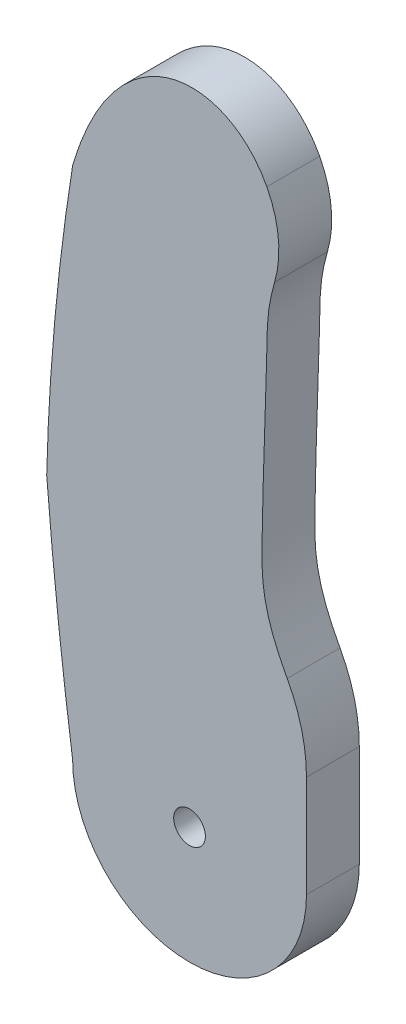
ISO-10303-21;
HEADER;
FILE_DESCRIPTION(('STEP AP214'),'2;1');
FILE_NAME('part.step','',(''),(''),'','','');
FILE_SCHEMA(('AUTOMOTIVE_DESIGN { 1 0 10303 214 1 1 1 1 }'));
ENDSEC;
DATA;
#1=APPLICATION_CONTEXT('core data for automotive mechanical design processes');
#2=APPLICATION_PROTOCOL_DEFINITION('international standard','automotive_design',2000,#1);
#3=PRODUCT_CONTEXT('',#1,'mechanical');
#4=PRODUCT('Part','Part','',(#3));
#5=PRODUCT_RELATED_PRODUCT_CATEGORY('part','',(#4));
#6=PRODUCT_DEFINITION_FORMATION('','',#4);
#7=PRODUCT_DEFINITION_CONTEXT('part definition',#1,'design');
#8=PRODUCT_DEFINITION('design','',#6,#7);
#9=PRODUCT_DEFINITION_SHAPE('','',#8);
#10=(LENGTH_UNIT() NAMED_UNIT(*) SI_UNIT(.MILLI.,.METRE.));
#11=(NAMED_UNIT(*) PLANE_ANGLE_UNIT() SI_UNIT($,.RADIAN.));
#12=(NAMED_UNIT(*) SI_UNIT($,.STERADIAN.) SOLID_ANGLE_UNIT());
#13=UNCERTAINTY_MEASURE_WITH_UNIT(LENGTH_MEASURE(1.E-05),#10,'distance_accuracy_value','');
#14=(GEOMETRIC_REPRESENTATION_CONTEXT(3) GLOBAL_UNCERTAINTY_ASSIGNED_CONTEXT((#13)) GLOBAL_UNIT_ASSIGNED_CONTEXT((#10,
#11,#12)) REPRESENTATION_CONTEXT('',''));
#15=CARTESIAN_POINT('',(0.,0.,0.));
#16=DIRECTION('',(0.,0.,1.));
#17=DIRECTION('',(1.,0.,0.));
#18=AXIS2_PLACEMENT_3D('',#15,#16,#17);
#19=CARTESIAN_POINT('',(-46.6058619597334,0.,5.));
#20=CARTESIAN_POINT('',(-45.7112575391299,-11.0890557128128,5.));
#21=CARTESIAN_POINT('',(-44.1531992134322,-22.0996926023876,5.));
#22=B_SPLINE_CURVE_WITH_KNOTS('',2,(#19,#20,#21),.UNSPECIFIED.,.F.,.F.,(3,3),(0.,1.),.UNSPECIFIED.);
#23=DIRECTION('',(0.,0.,-1.));
#24=VECTOR('',#23,1.);
#25=SURFACE_OF_LINEAR_EXTRUSION('',#22,#24);
#26=CARTESIAN_POINT('',(-46.6058619597334,0.,0.));
#27=CARTESIAN_POINT('',(-45.7112575391299,-11.0890557128128,0.));
#28=CARTESIAN_POINT('',(-44.1531992134322,-22.0996926023876,0.));
#29=B_SPLINE_CURVE_WITH_KNOTS('',2,(#26,#27,#28),.UNSPECIFIED.,.F.,.F.,(3,3),(0.,1.),.UNSPECIFIED.);
#30=CARTESIAN_POINT('',(-46.6058619597334,0.,0.));
#31=VERTEX_POINT('',#30);
#32=CARTESIAN_POINT('',(-44.1531992134322,-22.0996926023876,0.));
#33=VERTEX_POINT('',#32);
#34=EDGE_CURVE('E178',#31,#33,#29,.T.);
#35=ORIENTED_EDGE('',*,*,#34,.T.);
#36=DIRECTION('',(0.,0.,-1.));
#37=VECTOR('',#36,1.);
#38=CARTESIAN_POINT('',(-44.1531992134322,-22.0996926023876,5.));
#39=LINE('',#38,#37);
#40=CARTESIAN_POINT('',(-44.1531992134322,-22.0996926023876,5.));
#41=VERTEX_POINT('',#40);
#42=EDGE_CURVE('E11',#41,#33,#39,.T.);
#43=ORIENTED_EDGE('',*,*,#42,.F.);
#44=CARTESIAN_POINT('',(-46.6058619597334,0.,5.));
#45=VERTEX_POINT('',#44);
#46=EDGE_CURVE('E165',#45,#41,#22,.T.);
#47=ORIENTED_EDGE('',*,*,#46,.F.);
#48=DIRECTION('',(0.,0.,-1.));
#49=VECTOR('',#48,1.);
#50=CARTESIAN_POINT('',(-46.6058619597334,0.,5.));
#51=LINE('',#50,#49);
#52=EDGE_CURVE('E127',#45,#31,#51,.T.);
#53=ORIENTED_EDGE('',*,*,#52,.T.);
#54=EDGE_LOOP('',(#35,#43,#47,#53));
#55=FACE_BOUND('',#54,.T.);
#56=ADVANCED_FACE('F33',(#55),#25,.F.);
#57=CARTESIAN_POINT('',(-33.0893365251508,-22.0996926023876,5.));
#58=DIRECTION('',(0.,0.,-1.));
#59=DIRECTION('',(-1.,0.,0.));
#60=AXIS2_PLACEMENT_3D('',#57,#58,#59);
#61=CYLINDRICAL_SURFACE('',#60,11.0638626882813);
#62=CARTESIAN_POINT('',(-33.0893365251508,-22.0996926023876,0.));
#63=DIRECTION('',(0.,0.,1.));
#64=DIRECTION('',(1.,0.,0.));
#65=AXIS2_PLACEMENT_3D('',#62,#63,#64);
#66=CIRCLE('',#65,11.0638626882813);
#67=CARTESIAN_POINT('',(-22.0254738368695,-22.0996926023876,0.));
#68=VERTEX_POINT('',#67);
#69=EDGE_CURVE('E182',#33,#68,#66,.T.);
#70=ORIENTED_EDGE('',*,*,#69,.T.);
#71=DIRECTION('',(0.,0.,-1.));
#72=VECTOR('',#71,1.);
#73=CARTESIAN_POINT('',(-22.0254738368695,-22.0996926023876,5.));
#74=LINE('',#73,#72);
#75=CARTESIAN_POINT('',(-22.0254738368695,-22.0996926023876,5.));
#76=VERTEX_POINT('',#75);
#77=EDGE_CURVE('E43',#76,#68,#74,.T.);
#78=ORIENTED_EDGE('',*,*,#77,.F.);
#79=CARTESIAN_POINT('',(-33.0893365251508,-22.0996926023876,5.));
#80=DIRECTION('',(0.,0.,1.));
#81=DIRECTION('',(1.,0.,0.));
#82=AXIS2_PLACEMENT_3D('',#79,#80,#81);
#83=CIRCLE('',#82,11.0638626882813);
#84=EDGE_CURVE('E94',#41,#76,#83,.T.);
#85=ORIENTED_EDGE('',*,*,#84,.F.);
#86=ORIENTED_EDGE('',*,*,#42,.T.);
#87=EDGE_LOOP('',(#70,#78,#85,#86));
#88=FACE_BOUND('',#87,.T.);
#89=ADVANCED_FACE('F240',(#88),#61,.T.);
#90=CARTESIAN_POINT('',(-22.0254738368695,-12.4602884320922,5.));
#91=DIRECTION('',(-1.,0.,0.));
#92=DIRECTION('',(0.,-1.,0.));
#93=AXIS2_PLACEMENT_3D('',#90,#91,#92);
#94=PLANE('',#93);
#95=DIRECTION('',(0.,1.,0.));
#96=VECTOR('',#95,1.);
#97=CARTESIAN_POINT('',(-22.0254738368695,-12.4602884320922,0.));
#98=LINE('',#97,#96);
#99=CARTESIAN_POINT('',(-22.0254738368695,-12.4602884320922,0.));
#100=VERTEX_POINT('',#99);
#101=EDGE_CURVE('E186',#68,#100,#98,.T.);
#102=ORIENTED_EDGE('',*,*,#101,.T.);
#103=DIRECTION('',(0.,0.,-1.));
#104=VECTOR('',#103,1.);
#105=CARTESIAN_POINT('',(-22.0254738368695,-12.4602884320922,5.));
#106=LINE('',#105,#104);
#107=CARTESIAN_POINT('',(-22.0254738368695,-12.4602884320922,5.));
#108=VERTEX_POINT('',#107);
#109=EDGE_CURVE('E223',#108,#100,#106,.T.);
#110=ORIENTED_EDGE('',*,*,#109,.F.);
#111=DIRECTION('',(0.,1.,0.));
#112=VECTOR('',#111,1.);
#113=CARTESIAN_POINT('',(-22.0254738368695,-12.4602884320922,5.));
#114=LINE('',#113,#112);
#115=EDGE_CURVE('E163',#76,#108,#114,.T.);
#116=ORIENTED_EDGE('',*,*,#115,.F.);
#117=ORIENTED_EDGE('',*,*,#77,.T.);
#118=EDGE_LOOP('',(#102,#110,#116,#117));
#119=FACE_BOUND('',#118,.T.);
#120=ADVANCED_FACE('F230',(#119),#94,.F.);
#121=CARTESIAN_POINT('',(-37.0254738368695,-12.4602884320922,5.));
#122=DIRECTION('',(0.,0.,-1.));
#123=DIRECTION('',(-1.,0.,0.));
#124=AXIS2_PLACEMENT_3D('',#121,#122,#123);
#125=CYLINDRICAL_SURFACE('',#124,15.);
#126=CARTESIAN_POINT('',(-37.0254738368695,-12.4602884320922,0.));
#127=DIRECTION('',(0.,0.,1.));
#128=DIRECTION('',(-1.,0.,0.));
#129=AXIS2_PLACEMENT_3D('',#126,#127,#128);
#130=CIRCLE('',#129,15.);
#131=CARTESIAN_POINT('',(-23.8517565290266,-5.28720176782827,0.));
#132=VERTEX_POINT('',#131);
#133=EDGE_CURVE('E195',#100,#132,#130,.T.);
#134=ORIENTED_EDGE('',*,*,#133,.T.);
#135=DIRECTION('',(0.,0.,-1.));
#136=VECTOR('',#135,1.);
#137=CARTESIAN_POINT('',(-23.8517565290266,-5.28720176782827,5.));
#138=LINE('',#137,#136);
#139=CARTESIAN_POINT('',(-23.8517565290266,-5.28720176782827,5.));
#140=VERTEX_POINT('',#139);
#141=EDGE_CURVE('E220',#140,#132,#138,.T.);
#142=ORIENTED_EDGE('',*,*,#141,.F.);
#143=CARTESIAN_POINT('',(-37.0254738368695,-12.4602884320922,5.));
#144=DIRECTION('',(0.,0.,1.));
#145=DIRECTION('',(-1.,0.,0.));
#146=AXIS2_PLACEMENT_3D('',#143,#144,#145);
#147=CIRCLE('',#146,15.);
#148=EDGE_CURVE('E158',#108,#140,#147,.T.);
#149=ORIENTED_EDGE('',*,*,#148,.F.);
#150=ORIENTED_EDGE('',*,*,#109,.T.);
#151=EDGE_LOOP('',(#134,#142,#149,#150));
#152=FACE_BOUND('',#151,.T.);
#153=ADVANCED_FACE('F151',(#152),#125,.T.);
#154=CARTESIAN_POINT('',(-23.8517565290266,-5.28720176782827,5.));
#155=CARTESIAN_POINT('',(-26.2502571445017,-0.882240479911318,5.));
#156=CARTESIAN_POINT('',(-26.3074678451786,6.66899426599062,5.));
#157=CARTESIAN_POINT('',(-25.7197092182071,19.5048144764915,5.));
#158=CARTESIAN_POINT('',(-25.7600158726406,24.1411649653781,5.));
#159=CARTESIAN_POINT('',(-25.0422914726888,26.5821550938128,5.));
#160=B_SPLINE_CURVE_WITH_KNOTS('',3,(#154,#155,#156,#157,#158,#159),.UNSPECIFIED.,.F.,.F.,(4,1,
1,4),(0.0833383882535382,0.303134571149601,0.731012854933656,0.959193523349881),.UNSPECIFIED.);
#161=DIRECTION('',(0.,0.,-1.));
#162=VECTOR('',#161,1.);
#163=SURFACE_OF_LINEAR_EXTRUSION('',#160,#162);
#164=CARTESIAN_POINT('',(-23.8517565290266,-5.28720176782827,0.));
#165=CARTESIAN_POINT('',(-26.2502571445017,-0.882240479911318,0.));
#166=CARTESIAN_POINT('',(-26.3074678451786,6.66899426599062,0.));
#167=CARTESIAN_POINT('',(-25.7197092182071,19.5048144764915,0.));
#168=CARTESIAN_POINT('',(-25.7600158726406,24.1411649653781,0.));
#169=CARTESIAN_POINT('',(-25.0422914726888,26.5821550938128,0.));
#170=B_SPLINE_CURVE_WITH_KNOTS('',3,(#164,#165,#166,#167,#168,#169),.UNSPECIFIED.,.F.,.F.,(4,1,
1,4),(0.0833383882535382,0.303134571149601,0.731012854933656,0.959193523349881),.UNSPECIFIED.);
#171=CARTESIAN_POINT('',(-25.0422914726888,26.5821550938128,0.));
#172=VERTEX_POINT('',#171);
#173=EDGE_CURVE('E197',#132,#172,#170,.T.);
#174=ORIENTED_EDGE('',*,*,#173,.T.);
#175=DIRECTION('',(0.,0.,-1.));
#176=VECTOR('',#175,1.);
#177=CARTESIAN_POINT('',(-25.0422914726888,26.5821550938128,5.));
#178=LINE('',#177,#176);
#179=CARTESIAN_POINT('',(-25.0422914726888,26.5821550938128,5.));
#180=VERTEX_POINT('',#179);
#181=EDGE_CURVE('E122',#180,#172,#178,.T.);
#182=ORIENTED_EDGE('',*,*,#181,.F.);
#183=EDGE_CURVE('E113',#140,#180,#160,.T.);
#184=ORIENTED_EDGE('',*,*,#183,.F.);
#185=ORIENTED_EDGE('',*,*,#141,.T.);
#186=EDGE_LOOP('',(#174,#182,#184,#185));
#187=FACE_BOUND('',#186,.T.);
#188=ADVANCED_FACE('F148',(#187),#163,.F.);
#189=CARTESIAN_POINT('',(-34.6361740056399,29.4030446598781,5.));
#190=DIRECTION('',(0.,0.,-1.));
#191=DIRECTION('',(-1.,0.,0.));
#192=AXIS2_PLACEMENT_3D('',#189,#190,#191);
#193=CYLINDRICAL_SURFACE('',#192,10.);
#194=CARTESIAN_POINT('',(-34.6361740056399,29.4030446598781,0.));
#195=DIRECTION('',(0.,0.,1.));
#196=DIRECTION('',(-1.,0.,0.));
#197=AXIS2_PLACEMENT_3D('',#194,#195,#196);
#198=CIRCLE('',#197,10.);
#199=CARTESIAN_POINT('',(-25.7773883152089,34.0422165785523,0.));
#200=VERTEX_POINT('',#199);
#201=EDGE_CURVE('E121',#172,#200,#198,.T.);
#202=ORIENTED_EDGE('',*,*,#201,.T.);
#203=DIRECTION('',(0.,0.,-1.));
#204=VECTOR('',#203,1.);
#205=CARTESIAN_POINT('',(-25.7773883152089,34.0422165785523,5.));
#206=LINE('',#205,#204);
#207=CARTESIAN_POINT('',(-25.7773883152089,34.0422165785523,5.));
#208=VERTEX_POINT('',#207);
#209=EDGE_CURVE('E118',#208,#200,#206,.T.);
#210=ORIENTED_EDGE('',*,*,#209,.F.);
#211=CARTESIAN_POINT('',(-34.6361740056399,29.4030446598781,5.));
#212=DIRECTION('',(0.,0.,1.));
#213=DIRECTION('',(-1.,0.,0.));
#214=AXIS2_PLACEMENT_3D('',#211,#212,#213);
#215=CIRCLE('',#214,10.);
#216=EDGE_CURVE('E107',#180,#208,#215,.T.);
#217=ORIENTED_EDGE('',*,*,#216,.F.);
#218=ORIENTED_EDGE('',*,*,#181,.T.);
#219=EDGE_LOOP('',(#202,#210,#217,#218));
#220=FACE_BOUND('',#219,.T.);
#221=ADVANCED_FACE('F119',(#220),#193,.T.);
#222=CARTESIAN_POINT('',(-25.7773883152089,34.0422165785523,5.));
#223=CARTESIAN_POINT('',(-29.4087069674381,40.9764441255572,5.));
#224=CARTESIAN_POINT('',(-39.9004838670176,41.1834079776446,5.));
#225=CARTESIAN_POINT('',(-44.1531992134322,26.5821550938128,5.));
#226=B_SPLINE_CURVE_WITH_KNOTS('',3,(#222,#223,#224,#225),.UNSPECIFIED.,.F.,.F.,(4,4),(0.,
0.860338306806308),.UNSPECIFIED.);
#227=DIRECTION('',(0.,0.,-1.));
#228=VECTOR('',#227,1.);
#229=SURFACE_OF_LINEAR_EXTRUSION('',#226,#228);
#230=CARTESIAN_POINT('',(-25.7773883152089,34.0422165785523,0.));
#231=CARTESIAN_POINT('',(-29.4087069674381,40.9764441255572,0.));
#232=CARTESIAN_POINT('',(-39.9004838670176,41.1834079776446,0.));
#233=CARTESIAN_POINT('',(-44.1531992134322,26.5821550938128,0.));
#234=B_SPLINE_CURVE_WITH_KNOTS('',3,(#230,#231,#232,#233),.UNSPECIFIED.,.F.,.F.,(4,4),(0.,
0.860338306806308),.UNSPECIFIED.);
#235=CARTESIAN_POINT('',(-44.1531992134322,26.5821550938128,0.));
#236=VERTEX_POINT('',#235);
#237=EDGE_CURVE('E80',#200,#236,#234,.T.);
#238=ORIENTED_EDGE('',*,*,#237,.T.);
#239=DIRECTION('',(0.,0.,-1.));
#240=VECTOR('',#239,1.);
#241=CARTESIAN_POINT('',(-44.1531992134322,26.5821550938128,5.));
#242=LINE('',#241,#240);
#243=CARTESIAN_POINT('',(-44.1531992134322,26.5821550938128,5.));
#244=VERTEX_POINT('',#243);
#245=EDGE_CURVE('E123',#244,#236,#242,.T.);
#246=ORIENTED_EDGE('',*,*,#245,.F.);
#247=EDGE_CURVE('E111',#208,#244,#226,.T.);
#248=ORIENTED_EDGE('',*,*,#247,.F.);
#249=ORIENTED_EDGE('',*,*,#209,.T.);
#250=EDGE_LOOP('',(#238,#246,#248,#249));
#251=FACE_BOUND('',#250,.T.);
#252=ADVANCED_FACE('F125',(#251),#229,.F.);
#253=CARTESIAN_POINT('',(-44.1531992134322,26.5821550938128,5.));
#254=CARTESIAN_POINT('',(-46.2586926234084,13.3744841706048,5.));
#255=CARTESIAN_POINT('',(-46.6058619597334,0.,5.));
#256=B_SPLINE_CURVE_WITH_KNOTS('',2,(#253,#254,#255),.UNSPECIFIED.,.F.,.F.,(3,3),(0.,1.),.UNSPECIFIED.);
#257=DIRECTION('',(0.,0.,-1.));
#258=VECTOR('',#257,1.);
#259=SURFACE_OF_LINEAR_EXTRUSION('',#256,#258);
#260=CARTESIAN_POINT('',(-44.1531992134322,26.5821550938128,0.));
#261=CARTESIAN_POINT('',(-46.2586926234084,13.3744841706048,0.));
#262=CARTESIAN_POINT('',(-46.6058619597334,0.,0.));
#263=B_SPLINE_CURVE_WITH_KNOTS('',2,(#260,#261,#262),.UNSPECIFIED.,.F.,.F.,(3,3),(0.,1.),.UNSPECIFIED.);
#264=EDGE_CURVE('E86',#236,#31,#263,.T.);
#265=ORIENTED_EDGE('',*,*,#264,.T.);
#266=ORIENTED_EDGE('',*,*,#52,.F.);
#267=EDGE_CURVE('E51',#244,#45,#256,.T.);
#268=ORIENTED_EDGE('',*,*,#267,.F.);
#269=ORIENTED_EDGE('',*,*,#245,.T.);
#270=EDGE_LOOP('',(#265,#266,#268,#269));
#271=FACE_BOUND('',#270,.T.);
#272=ADVANCED_FACE('F144',(#271),#259,.F.);
#273=CARTESIAN_POINT('',(-45.5453940628563,-11.0694510070033,5.));
#274=DIRECTION('',(0.,0.,-1.));
#275=DIRECTION('',(-1.,0.,0.));
#276=AXIS2_PLACEMENT_3D('',#273,#274,#275);
#277=PLANE('',#276);
#278=CARTESIAN_POINT('',(-33.0893365251508,-22.0996926023876,5.));
#279=DIRECTION('',(0.,0.,1.));
#280=DIRECTION('',(1.,0.,0.));
#281=AXIS2_PLACEMENT_3D('',#278,#279,#280);
#282=CIRCLE('',#281,1.5);
#283=CARTESIAN_POINT('',(-31.5893365251508,-22.0996926023876,5.));
#284=VERTEX_POINT('',#283);
#285=EDGE_CURVE('E170',#284,#284,#282,.T.);
#286=ORIENTED_EDGE('',*,*,#285,.F.);
#287=EDGE_LOOP('',(#286));
#288=FACE_BOUND('',#287,.T.);
#289=ORIENTED_EDGE('',*,*,#46,.T.);
#290=ORIENTED_EDGE('',*,*,#84,.T.);
#291=ORIENTED_EDGE('',*,*,#115,.T.);
#292=ORIENTED_EDGE('',*,*,#148,.T.);
#293=ORIENTED_EDGE('',*,*,#183,.T.);
#294=ORIENTED_EDGE('',*,*,#216,.T.);
#295=ORIENTED_EDGE('',*,*,#247,.T.);
#296=ORIENTED_EDGE('',*,*,#267,.T.);
#297=EDGE_LOOP('',(#289,#290,#291,#292,#293,#294,#295,#296));
#298=FACE_BOUND('',#297,.T.);
#299=ADVANCED_FACE('F109',(#288,#298),#277,.F.);
#300=CARTESIAN_POINT('',(-45.5453940628563,-11.0694510070033,0.));
#301=DIRECTION('',(0.,0.,-1.));
#302=DIRECTION('',(-1.,0.,0.));
#303=AXIS2_PLACEMENT_3D('',#300,#301,#302);
#304=PLANE('',#303);
#305=CARTESIAN_POINT('',(-33.0893365251508,-22.0996926023876,0.));
#306=DIRECTION('',(0.,0.,-1.));
#307=DIRECTION('',(-1.,0.,0.));
#308=AXIS2_PLACEMENT_3D('',#305,#306,#307);
#309=CIRCLE('',#308,1.5);
#310=CARTESIAN_POINT('',(-34.5893365251508,-22.0996926023876,0.));
#311=VERTEX_POINT('',#310);
#312=EDGE_CURVE('E37',#311,#311,#309,.T.);
#313=ORIENTED_EDGE('',*,*,#312,.F.);
#314=EDGE_LOOP('',(#313));
#315=FACE_BOUND('',#314,.T.);
#316=ORIENTED_EDGE('',*,*,#34,.F.);
#317=ORIENTED_EDGE('',*,*,#264,.F.);
#318=ORIENTED_EDGE('',*,*,#237,.F.);
#319=ORIENTED_EDGE('',*,*,#201,.F.);
#320=ORIENTED_EDGE('',*,*,#173,.F.);
#321=ORIENTED_EDGE('',*,*,#133,.F.);
#322=ORIENTED_EDGE('',*,*,#101,.F.);
#323=ORIENTED_EDGE('',*,*,#69,.F.);
#324=EDGE_LOOP('',(#316,#317,#318,#319,#320,#321,#322,#323));
#325=FACE_BOUND('',#324,.T.);
#326=ADVANCED_FACE('F234',(#315,#325),#304,.T.);
#327=CARTESIAN_POINT('',(-33.0893365251508,-22.0996926023876,-10.));
#328=DIRECTION('',(0.,0.,1.));
#329=DIRECTION('',(1.,0.,0.));
#330=AXIS2_PLACEMENT_3D('',#327,#328,#329);
#331=CYLINDRICAL_SURFACE('',#330,1.5);
#332=ORIENTED_EDGE('',*,*,#312,.T.);
#333=EDGE_LOOP('',(#332));
#334=FACE_BOUND('',#333,.T.);
#335=ORIENTED_EDGE('',*,*,#285,.T.);
#336=EDGE_LOOP('',(#335));
#337=FACE_BOUND('',#336,.T.);
#338=ADVANCED_FACE('F308',(#334,#337),#331,.F.);
#339=CLOSED_SHELL('',(#56,#89,#120,#153,#188,#221,#252,#272,#299,#326,#338));
#340=MANIFOLD_SOLID_BREP('B2',#339);
#341=ADVANCED_BREP_SHAPE_REPRESENTATION('',(#18,#340),#14);
#342=SHAPE_DEFINITION_REPRESENTATION(#9,#341);
ENDSEC;
END-ISO-10303-21;
